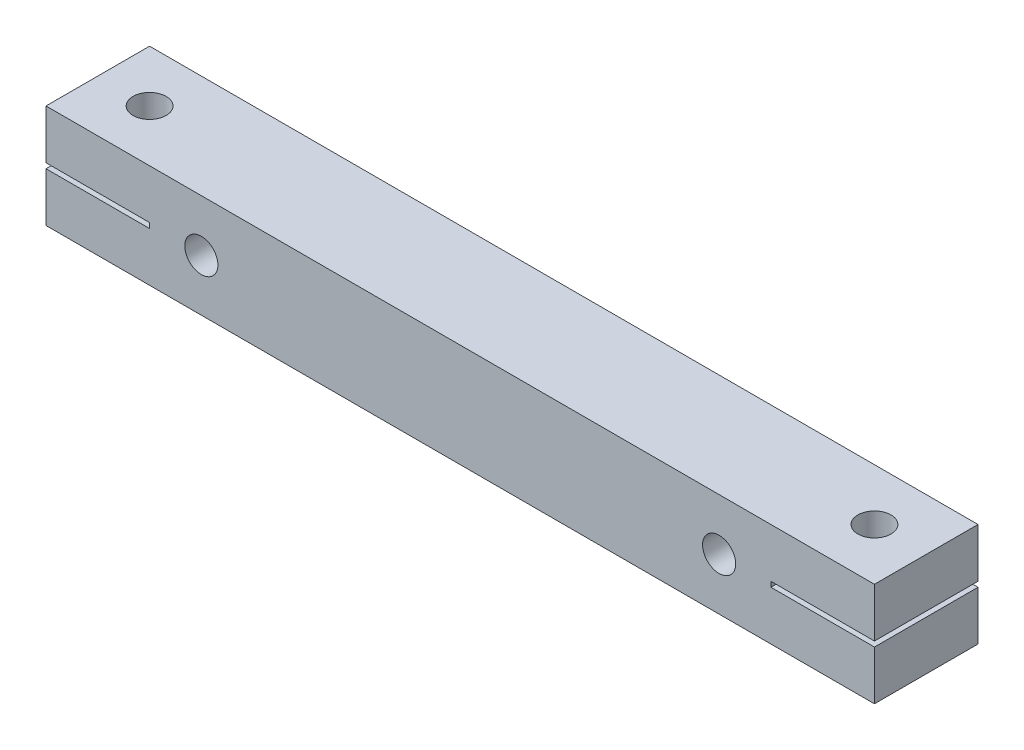
ISO-10303-21;
HEADER;
FILE_DESCRIPTION(('STEP AP214'),'2;1');
FILE_NAME('part.step','',(''),(''),'','','');
FILE_SCHEMA(('AUTOMOTIVE_DESIGN { 1 0 10303 214 1 1 1 1 }'));
ENDSEC;
DATA;
#1=APPLICATION_CONTEXT('core data for automotive mechanical design processes');
#2=APPLICATION_PROTOCOL_DEFINITION('international standard','automotive_design',2000,#1);
#3=PRODUCT_CONTEXT('',#1,'mechanical');
#4=PRODUCT('Part','Part','',(#3));
#5=PRODUCT_RELATED_PRODUCT_CATEGORY('part','',(#4));
#6=PRODUCT_DEFINITION_FORMATION('','',#4);
#7=PRODUCT_DEFINITION_CONTEXT('part definition',#1,'design');
#8=PRODUCT_DEFINITION('design','',#6,#7);
#9=PRODUCT_DEFINITION_SHAPE('','',#8);
#10=(LENGTH_UNIT() NAMED_UNIT(*) SI_UNIT(.MILLI.,.METRE.));
#11=(NAMED_UNIT(*) PLANE_ANGLE_UNIT() SI_UNIT($,.RADIAN.));
#12=(NAMED_UNIT(*) SI_UNIT($,.STERADIAN.) SOLID_ANGLE_UNIT());
#13=UNCERTAINTY_MEASURE_WITH_UNIT(LENGTH_MEASURE(1.E-05),#10,'distance_accuracy_value','');
#14=(GEOMETRIC_REPRESENTATION_CONTEXT(3) GLOBAL_UNCERTAINTY_ASSIGNED_CONTEXT((#13)) GLOBAL_UNIT_ASSIGNED_CONTEXT((#10,
#11,#12)) REPRESENTATION_CONTEXT('',''));
#15=CARTESIAN_POINT('',(0.,0.,0.));
#16=DIRECTION('',(0.,0.,1.));
#17=DIRECTION('',(1.,0.,0.));
#18=AXIS2_PLACEMENT_3D('',#15,#16,#17);
#19=CARTESIAN_POINT('',(0.,5.,5.));
#20=DIRECTION('',(1.,0.,0.));
#21=DIRECTION('',(0.,0.,-1.));
#22=AXIS2_PLACEMENT_3D('',#19,#20,#21);
#23=PLANE('',#22);
#24=DIRECTION('',(0.,0.,1.));
#25=VECTOR('',#24,1.);
#26=CARTESIAN_POINT('',(0.,0.25,-5.));
#27=LINE('',#26,#25);
#28=CARTESIAN_POINT('',(0.,0.25,-5.));
#29=VERTEX_POINT('',#28);
#30=CARTESIAN_POINT('',(0.,0.25,5.));
#31=VERTEX_POINT('',#30);
#32=EDGE_CURVE('E64',#29,#31,#27,.T.);
#33=ORIENTED_EDGE('',*,*,#32,.T.);
#34=DIRECTION('',(0.,-1.,0.));
#35=VECTOR('',#34,1.);
#36=CARTESIAN_POINT('',(0.,5.,5.));
#37=LINE('',#36,#35);
#38=CARTESIAN_POINT('',(0.,5.,5.));
#39=VERTEX_POINT('',#38);
#40=EDGE_CURVE('E192',#39,#31,#37,.T.);
#41=ORIENTED_EDGE('',*,*,#40,.F.);
#42=DIRECTION('',(0.,0.,-1.));
#43=VECTOR('',#42,1.);
#44=CARTESIAN_POINT('',(0.,5.,5.));
#45=LINE('',#44,#43);
#46=CARTESIAN_POINT('',(0.,5.,-5.));
#47=VERTEX_POINT('',#46);
#48=EDGE_CURVE('E204',#39,#47,#45,.T.);
#49=ORIENTED_EDGE('',*,*,#48,.T.);
#50=DIRECTION('',(0.,-1.,0.));
#51=VECTOR('',#50,1.);
#52=CARTESIAN_POINT('',(0.,5.,-5.));
#53=LINE('',#52,#51);
#54=EDGE_CURVE('E205',#47,#29,#53,.T.);
#55=ORIENTED_EDGE('',*,*,#54,.T.);
#56=EDGE_LOOP('',(#33,#41,#49,#55));
#57=FACE_BOUND('',#56,.T.);
#58=ADVANCED_FACE('F39',(#57),#23,.F.);
#59=CARTESIAN_POINT('',(80.,-5.,5.));
#60=DIRECTION('',(-1.,0.,0.));
#61=DIRECTION('',(0.,0.,1.));
#62=AXIS2_PLACEMENT_3D('',#59,#60,#61);
#63=PLANE('',#62);
#64=DIRECTION('',(0.,0.,1.));
#65=VECTOR('',#64,1.);
#66=CARTESIAN_POINT('',(80.,-0.250000000000005,-5.));
#67=LINE('',#66,#65);
#68=CARTESIAN_POINT('',(80.,-0.250000000000005,-5.));
#69=VERTEX_POINT('',#68);
#70=CARTESIAN_POINT('',(80.,-0.250000000000005,5.));
#71=VERTEX_POINT('',#70);
#72=EDGE_CURVE('E187',#69,#71,#67,.T.);
#73=ORIENTED_EDGE('',*,*,#72,.T.);
#74=DIRECTION('',(0.,1.,0.));
#75=VECTOR('',#74,1.);
#76=CARTESIAN_POINT('',(80.,-5.,5.));
#77=LINE('',#76,#75);
#78=CARTESIAN_POINT('',(80.,-5.,5.));
#79=VERTEX_POINT('',#78);
#80=EDGE_CURVE('E199',#79,#71,#77,.T.);
#81=ORIENTED_EDGE('',*,*,#80,.F.);
#82=DIRECTION('',(0.,0.,-1.));
#83=VECTOR('',#82,1.);
#84=CARTESIAN_POINT('',(80.,-5.,5.));
#85=LINE('',#84,#83);
#86=CARTESIAN_POINT('',(80.,-5.,-5.));
#87=VERTEX_POINT('',#86);
#88=EDGE_CURVE('E48',#79,#87,#85,.T.);
#89=ORIENTED_EDGE('',*,*,#88,.T.);
#90=DIRECTION('',(0.,1.,0.));
#91=VECTOR('',#90,1.);
#92=CARTESIAN_POINT('',(80.,-5.,-5.));
#93=LINE('',#92,#91);
#94=EDGE_CURVE('E210',#87,#69,#93,.T.);
#95=ORIENTED_EDGE('',*,*,#94,.T.);
#96=EDGE_LOOP('',(#73,#81,#89,#95));
#97=FACE_BOUND('',#96,.T.);
#98=ADVANCED_FACE('F279',(#97),#63,.F.);
#99=CARTESIAN_POINT('',(0.,-0.25,5.));
#100=VERTEX_POINT('',#99);
#101=CARTESIAN_POINT('',(0.,-5.,5.));
#102=VERTEX_POINT('',#101);
#103=EDGE_CURVE('E196',#100,#102,#37,.T.);
#104=ORIENTED_EDGE('',*,*,#103,.F.);
#105=DIRECTION('',(0.,0.,1.));
#106=VECTOR('',#105,1.);
#107=CARTESIAN_POINT('',(0.,-0.25,-5.));
#108=LINE('',#107,#106);
#109=CARTESIAN_POINT('',(0.,-0.25,-5.));
#110=VERTEX_POINT('',#109);
#111=EDGE_CURVE('E166',#110,#100,#108,.T.);
#112=ORIENTED_EDGE('',*,*,#111,.F.);
#113=CARTESIAN_POINT('',(0.,-5.,-5.));
#114=VERTEX_POINT('',#113);
#115=EDGE_CURVE('E165',#110,#114,#53,.T.);
#116=ORIENTED_EDGE('',*,*,#115,.T.);
#117=DIRECTION('',(0.,0.,-1.));
#118=VECTOR('',#117,1.);
#119=CARTESIAN_POINT('',(0.,-5.,5.));
#120=LINE('',#119,#118);
#121=EDGE_CURVE('E11',#102,#114,#120,.T.);
#122=ORIENTED_EDGE('',*,*,#121,.F.);
#123=EDGE_LOOP('',(#104,#112,#116,#122));
#124=FACE_BOUND('',#123,.T.);
#125=ADVANCED_FACE('F41',(#124),#23,.F.);
#126=CARTESIAN_POINT('',(0.,-5.,5.));
#127=DIRECTION('',(0.,1.,0.));
#128=DIRECTION('',(0.,0.,1.));
#129=AXIS2_PLACEMENT_3D('',#126,#127,#128);
#130=PLANE('',#129);
#131=CARTESIAN_POINT('',(5.,-5.00000000000001,0.));
#132=DIRECTION('',(0.,1.,0.));
#133=DIRECTION('',(-1.,0.,0.));
#134=AXIS2_PLACEMENT_3D('',#131,#132,#133);
#135=CIRCLE('',#134,1.6);
#136=CARTESIAN_POINT('',(3.4,-5.00000000000001,0.));
#137=VERTEX_POINT('',#136);
#138=EDGE_CURVE('E224',#137,#137,#135,.T.);
#139=ORIENTED_EDGE('',*,*,#138,.T.);
#140=EDGE_LOOP('',(#139));
#141=FACE_BOUND('',#140,.T.);
#142=CARTESIAN_POINT('',(75.,-5.,0.));
#143=DIRECTION('',(0.,1.,0.));
#144=DIRECTION('',(-1.,0.,0.));
#145=AXIS2_PLACEMENT_3D('',#142,#143,#144);
#146=CIRCLE('',#145,1.60000000000001);
#147=CARTESIAN_POINT('',(73.4,-5.,0.));
#148=VERTEX_POINT('',#147);
#149=EDGE_CURVE('E242',#148,#148,#146,.T.);
#150=ORIENTED_EDGE('',*,*,#149,.T.);
#151=EDGE_LOOP('',(#150));
#152=FACE_BOUND('',#151,.T.);
#153=DIRECTION('',(1.,0.,0.));
#154=VECTOR('',#153,1.);
#155=CARTESIAN_POINT('',(0.,-5.,-5.));
#156=LINE('',#155,#154);
#157=EDGE_CURVE('E207',#114,#87,#156,.T.);
#158=ORIENTED_EDGE('',*,*,#157,.T.);
#159=ORIENTED_EDGE('',*,*,#88,.F.);
#160=DIRECTION('',(1.,0.,0.));
#161=VECTOR('',#160,1.);
#162=CARTESIAN_POINT('',(0.,-5.,5.));
#163=LINE('',#162,#161);
#164=EDGE_CURVE('E195',#102,#79,#163,.T.);
#165=ORIENTED_EDGE('',*,*,#164,.F.);
#166=ORIENTED_EDGE('',*,*,#121,.T.);
#167=EDGE_LOOP('',(#158,#159,#165,#166));
#168=FACE_BOUND('',#167,.T.);
#169=ADVANCED_FACE('F288',(#141,#152,#168),#130,.F.);
#170=CARTESIAN_POINT('',(80.,0.250000000000006,5.));
#171=VERTEX_POINT('',#170);
#172=CARTESIAN_POINT('',(80.,5.,5.));
#173=VERTEX_POINT('',#172);
#174=EDGE_CURVE('E198',#171,#173,#77,.T.);
#175=ORIENTED_EDGE('',*,*,#174,.F.);
#176=DIRECTION('',(0.,0.,1.));
#177=VECTOR('',#176,1.);
#178=CARTESIAN_POINT('',(80.,0.250000000000006,-5.));
#179=LINE('',#178,#177);
#180=CARTESIAN_POINT('',(80.,0.250000000000006,-5.));
#181=VERTEX_POINT('',#180);
#182=EDGE_CURVE('E161',#181,#171,#179,.T.);
#183=ORIENTED_EDGE('',*,*,#182,.F.);
#184=CARTESIAN_POINT('',(80.,5.,-5.));
#185=VERTEX_POINT('',#184);
#186=EDGE_CURVE('E209',#181,#185,#93,.T.);
#187=ORIENTED_EDGE('',*,*,#186,.T.);
#188=DIRECTION('',(0.,0.,-1.));
#189=VECTOR('',#188,1.);
#190=CARTESIAN_POINT('',(80.,5.,5.));
#191=LINE('',#190,#189);
#192=EDGE_CURVE('E217',#173,#185,#191,.T.);
#193=ORIENTED_EDGE('',*,*,#192,.F.);
#194=EDGE_LOOP('',(#175,#183,#187,#193));
#195=FACE_BOUND('',#194,.T.);
#196=ADVANCED_FACE('F286',(#195),#63,.F.);
#197=CARTESIAN_POINT('',(80.,5.,5.));
#198=DIRECTION('',(0.,-1.,0.));
#199=DIRECTION('',(0.,0.,-1.));
#200=AXIS2_PLACEMENT_3D('',#197,#198,#199);
#201=PLANE('',#200);
#202=CARTESIAN_POINT('',(5.,5.,0.));
#203=DIRECTION('',(0.,1.,0.));
#204=DIRECTION('',(-1.,0.,0.));
#205=AXIS2_PLACEMENT_3D('',#202,#203,#204);
#206=CIRCLE('',#205,1.6);
#207=CARTESIAN_POINT('',(3.4,5.,0.));
#208=VERTEX_POINT('',#207);
#209=EDGE_CURVE('E229',#208,#208,#206,.T.);
#210=ORIENTED_EDGE('',*,*,#209,.F.);
#211=EDGE_LOOP('',(#210));
#212=FACE_BOUND('',#211,.T.);
#213=CARTESIAN_POINT('',(75.,5.00000000000001,0.));
#214=DIRECTION('',(0.,1.,0.));
#215=DIRECTION('',(-1.,0.,0.));
#216=AXIS2_PLACEMENT_3D('',#213,#214,#215);
#217=CIRCLE('',#216,1.60000000000001);
#218=CARTESIAN_POINT('',(73.4,5.00000000000001,0.));
#219=VERTEX_POINT('',#218);
#220=EDGE_CURVE('E234',#219,#219,#217,.T.);
#221=ORIENTED_EDGE('',*,*,#220,.F.);
#222=EDGE_LOOP('',(#221));
#223=FACE_BOUND('',#222,.T.);
#224=DIRECTION('',(-1.,0.,0.));
#225=VECTOR('',#224,1.);
#226=CARTESIAN_POINT('',(80.,5.,-5.));
#227=LINE('',#226,#225);
#228=EDGE_CURVE('E213',#185,#47,#227,.T.);
#229=ORIENTED_EDGE('',*,*,#228,.T.);
#230=ORIENTED_EDGE('',*,*,#48,.F.);
#231=DIRECTION('',(-1.,0.,0.));
#232=VECTOR('',#231,1.);
#233=CARTESIAN_POINT('',(80.,5.,5.));
#234=LINE('',#233,#232);
#235=EDGE_CURVE('E202',#173,#39,#234,.T.);
#236=ORIENTED_EDGE('',*,*,#235,.F.);
#237=ORIENTED_EDGE('',*,*,#192,.T.);
#238=EDGE_LOOP('',(#229,#230,#236,#237));
#239=FACE_BOUND('',#238,.T.);
#240=ADVANCED_FACE('F323',(#212,#223,#239),#201,.F.);
#241=CARTESIAN_POINT('',(0.,0.,5.));
#242=DIRECTION('',(0.,0.,1.));
#243=DIRECTION('',(1.,0.,0.));
#244=AXIS2_PLACEMENT_3D('',#241,#242,#243);
#245=PLANE('',#244);
#246=CARTESIAN_POINT('',(15.,0.,5.));
#247=DIRECTION('',(0.,0.,1.));
#248=DIRECTION('',(1.,0.,0.));
#249=AXIS2_PLACEMENT_3D('',#246,#247,#248);
#250=CIRCLE('',#249,1.6);
#251=CARTESIAN_POINT('',(16.6,0.,5.));
#252=VERTEX_POINT('',#251);
#253=EDGE_CURVE('E248',#252,#252,#250,.T.);
#254=ORIENTED_EDGE('',*,*,#253,.F.);
#255=EDGE_LOOP('',(#254));
#256=FACE_BOUND('',#255,.T.);
#257=CARTESIAN_POINT('',(65.,0.,5.));
#258=DIRECTION('',(0.,0.,1.));
#259=DIRECTION('',(1.,0.,0.));
#260=AXIS2_PLACEMENT_3D('',#257,#258,#259);
#261=CIRCLE('',#260,1.60000000000001);
#262=CARTESIAN_POINT('',(66.6,0.,5.));
#263=VERTEX_POINT('',#262);
#264=EDGE_CURVE('E253',#263,#263,#261,.T.);
#265=ORIENTED_EDGE('',*,*,#264,.F.);
#266=EDGE_LOOP('',(#265));
#267=FACE_BOUND('',#266,.T.);
#268=DIRECTION('',(1.,0.,0.));
#269=VECTOR('',#268,1.);
#270=CARTESIAN_POINT('',(0.,-0.25,5.));
#271=LINE('',#270,#269);
#272=CARTESIAN_POINT('',(10.,-0.25,5.));
#273=VERTEX_POINT('',#272);
#274=EDGE_CURVE('E150',#100,#273,#271,.T.);
#275=ORIENTED_EDGE('',*,*,#274,.F.);
#276=ORIENTED_EDGE('',*,*,#103,.T.);
#277=ORIENTED_EDGE('',*,*,#164,.T.);
#278=ORIENTED_EDGE('',*,*,#80,.T.);
#279=DIRECTION('',(-1.,0.,0.));
#280=VECTOR('',#279,1.);
#281=CARTESIAN_POINT('',(0.,-0.250000000000015,5.));
#282=LINE('',#281,#280);
#283=CARTESIAN_POINT('',(70.,-0.250000000000006,5.));
#284=VERTEX_POINT('',#283);
#285=EDGE_CURVE('E173',#71,#284,#282,.T.);
#286=ORIENTED_EDGE('',*,*,#285,.T.);
#287=DIRECTION('',(0.,-1.,0.));
#288=VECTOR('',#287,1.);
#289=CARTESIAN_POINT('',(70.,0.,5.));
#290=LINE('',#289,#288);
#291=CARTESIAN_POINT('',(70.,0.250000000000006,5.));
#292=VERTEX_POINT('',#291);
#293=EDGE_CURVE('E182',#292,#284,#290,.T.);
#294=ORIENTED_EDGE('',*,*,#293,.F.);
#295=DIRECTION('',(-1.,0.,0.));
#296=VECTOR('',#295,1.);
#297=CARTESIAN_POINT('',(0.,0.250000000000015,5.));
#298=LINE('',#297,#296);
#299=EDGE_CURVE('E179',#171,#292,#298,.T.);
#300=ORIENTED_EDGE('',*,*,#299,.F.);
#301=ORIENTED_EDGE('',*,*,#174,.T.);
#302=ORIENTED_EDGE('',*,*,#235,.T.);
#303=ORIENTED_EDGE('',*,*,#40,.T.);
#304=DIRECTION('',(1.,0.,0.));
#305=VECTOR('',#304,1.);
#306=CARTESIAN_POINT('',(0.,0.25,5.));
#307=LINE('',#306,#305);
#308=CARTESIAN_POINT('',(10.,0.25,5.));
#309=VERTEX_POINT('',#308);
#310=EDGE_CURVE('E153',#31,#309,#307,.T.);
#311=ORIENTED_EDGE('',*,*,#310,.T.);
#312=DIRECTION('',(0.,-1.,0.));
#313=VECTOR('',#312,1.);
#314=CARTESIAN_POINT('',(10.,0.,5.));
#315=LINE('',#314,#313);
#316=EDGE_CURVE('E144',#309,#273,#315,.T.);
#317=ORIENTED_EDGE('',*,*,#316,.T.);
#318=EDGE_LOOP('',(#275,#276,#277,#278,#286,#294,#300,#301,#302,#303,#311,#317));
#319=FACE_BOUND('',#318,.T.);
#320=ADVANCED_FACE('F300',(#256,#267,#319),#245,.T.);
#321=CARTESIAN_POINT('',(0.,0.,-5.));
#322=DIRECTION('',(0.,0.,1.));
#323=DIRECTION('',(1.,0.,0.));
#324=AXIS2_PLACEMENT_3D('',#321,#322,#323);
#325=PLANE('',#324);
#326=CARTESIAN_POINT('',(15.,0.,-5.));
#327=DIRECTION('',(0.,0.,1.));
#328=DIRECTION('',(1.,0.,0.));
#329=AXIS2_PLACEMENT_3D('',#326,#327,#328);
#330=CIRCLE('',#329,1.6);
#331=CARTESIAN_POINT('',(16.6,0.,-5.));
#332=VERTEX_POINT('',#331);
#333=EDGE_CURVE('E244',#332,#332,#330,.T.);
#334=ORIENTED_EDGE('',*,*,#333,.T.);
#335=EDGE_LOOP('',(#334));
#336=FACE_BOUND('',#335,.T.);
#337=CARTESIAN_POINT('',(65.,0.,-5.));
#338=DIRECTION('',(0.,0.,1.));
#339=DIRECTION('',(1.,0.,0.));
#340=AXIS2_PLACEMENT_3D('',#337,#338,#339);
#341=CIRCLE('',#340,1.60000000000001);
#342=CARTESIAN_POINT('',(66.6,0.,-5.));
#343=VERTEX_POINT('',#342);
#344=EDGE_CURVE('E237',#343,#343,#341,.T.);
#345=ORIENTED_EDGE('',*,*,#344,.T.);
#346=EDGE_LOOP('',(#345));
#347=FACE_BOUND('',#346,.T.);
#348=ORIENTED_EDGE('',*,*,#115,.F.);
#349=DIRECTION('',(1.,0.,0.));
#350=VECTOR('',#349,1.);
#351=CARTESIAN_POINT('',(0.,-0.25,-5.));
#352=LINE('',#351,#350);
#353=CARTESIAN_POINT('',(10.,-0.25,-5.));
#354=VERTEX_POINT('',#353);
#355=EDGE_CURVE('E137',#110,#354,#352,.T.);
#356=ORIENTED_EDGE('',*,*,#355,.T.);
#357=DIRECTION('',(0.,-1.,0.));
#358=VECTOR('',#357,1.);
#359=CARTESIAN_POINT('',(10.,0.,-5.));
#360=LINE('',#359,#358);
#361=CARTESIAN_POINT('',(10.,0.25,-5.));
#362=VERTEX_POINT('',#361);
#363=EDGE_CURVE('E138',#362,#354,#360,.T.);
#364=ORIENTED_EDGE('',*,*,#363,.F.);
#365=DIRECTION('',(1.,0.,0.));
#366=VECTOR('',#365,1.);
#367=CARTESIAN_POINT('',(0.,0.25,-5.));
#368=LINE('',#367,#366);
#369=EDGE_CURVE('E128',#29,#362,#368,.T.);
#370=ORIENTED_EDGE('',*,*,#369,.F.);
#371=ORIENTED_EDGE('',*,*,#54,.F.);
#372=ORIENTED_EDGE('',*,*,#228,.F.);
#373=ORIENTED_EDGE('',*,*,#186,.F.);
#374=DIRECTION('',(-1.,0.,0.));
#375=VECTOR('',#374,1.);
#376=CARTESIAN_POINT('',(0.,0.250000000000015,-5.));
#377=LINE('',#376,#375);
#378=CARTESIAN_POINT('',(70.,0.250000000000006,-5.));
#379=VERTEX_POINT('',#378);
#380=EDGE_CURVE('E169',#181,#379,#377,.T.);
#381=ORIENTED_EDGE('',*,*,#380,.T.);
#382=DIRECTION('',(0.,-1.,0.));
#383=VECTOR('',#382,1.);
#384=CARTESIAN_POINT('',(70.,0.,-5.));
#385=LINE('',#384,#383);
#386=CARTESIAN_POINT('',(70.,-0.250000000000006,-5.));
#387=VERTEX_POINT('',#386);
#388=EDGE_CURVE('E172',#379,#387,#385,.T.);
#389=ORIENTED_EDGE('',*,*,#388,.T.);
#390=DIRECTION('',(-1.,0.,0.));
#391=VECTOR('',#390,1.);
#392=CARTESIAN_POINT('',(0.,-0.250000000000015,-5.));
#393=LINE('',#392,#391);
#394=EDGE_CURVE('E176',#69,#387,#393,.T.);
#395=ORIENTED_EDGE('',*,*,#394,.F.);
#396=ORIENTED_EDGE('',*,*,#94,.F.);
#397=ORIENTED_EDGE('',*,*,#157,.F.);
#398=EDGE_LOOP('',(#348,#356,#364,#370,#371,#372,#373,#381,#389,#395,#396,#397));
#399=FACE_BOUND('',#398,.T.);
#400=ADVANCED_FACE('F149',(#336,#347,#399),#325,.F.);
#401=CARTESIAN_POINT('',(0.,0.250000000000015,-5.));
#402=DIRECTION('',(0.,1.,0.));
#403=DIRECTION('',(-1.,0.,0.));
#404=AXIS2_PLACEMENT_3D('',#401,#402,#403);
#405=PLANE('',#404);
#406=CARTESIAN_POINT('',(75.,0.250000000000005,0.));
#407=DIRECTION('',(0.,1.,0.));
#408=DIRECTION('',(-1.,0.,0.));
#409=AXIS2_PLACEMENT_3D('',#406,#407,#408);
#410=CIRCLE('',#409,1.60000000000001);
#411=CARTESIAN_POINT('',(73.4,0.250000000000006,0.));
#412=VERTEX_POINT('',#411);
#413=EDGE_CURVE('E156',#412,#412,#410,.T.);
#414=ORIENTED_EDGE('',*,*,#413,.T.);
#415=EDGE_LOOP('',(#414));
#416=FACE_BOUND('',#415,.T.);
#417=ORIENTED_EDGE('',*,*,#299,.T.);
#418=DIRECTION('',(0.,0.,1.));
#419=VECTOR('',#418,1.);
#420=CARTESIAN_POINT('',(70.,0.250000000000006,-5.));
#421=LINE('',#420,#419);
#422=EDGE_CURVE('E178',#379,#292,#421,.T.);
#423=ORIENTED_EDGE('',*,*,#422,.F.);
#424=ORIENTED_EDGE('',*,*,#380,.F.);
#425=ORIENTED_EDGE('',*,*,#182,.T.);
#426=EDGE_LOOP('',(#417,#423,#424,#425));
#427=FACE_BOUND('',#426,.T.);
#428=ADVANCED_FACE('F313',(#416,#427),#405,.F.);
#429=CARTESIAN_POINT('',(0.,-0.250000000000015,-5.));
#430=DIRECTION('',(0.,1.,0.));
#431=DIRECTION('',(-1.,0.,0.));
#432=AXIS2_PLACEMENT_3D('',#429,#430,#431);
#433=PLANE('',#432);
#434=CARTESIAN_POINT('',(75.,-0.250000000000005,0.));
#435=DIRECTION('',(0.,1.,0.));
#436=DIRECTION('',(-1.,0.,0.));
#437=AXIS2_PLACEMENT_3D('',#434,#435,#436);
#438=CIRCLE('',#437,1.60000000000001);
#439=CARTESIAN_POINT('',(73.4,-0.250000000000006,0.));
#440=VERTEX_POINT('',#439);
#441=EDGE_CURVE('E43',#440,#440,#438,.T.);
#442=ORIENTED_EDGE('',*,*,#441,.F.);
#443=EDGE_LOOP('',(#442));
#444=FACE_BOUND('',#443,.T.);
#445=ORIENTED_EDGE('',*,*,#285,.F.);
#446=ORIENTED_EDGE('',*,*,#72,.F.);
#447=ORIENTED_EDGE('',*,*,#394,.T.);
#448=DIRECTION('',(0.,0.,1.));
#449=VECTOR('',#448,1.);
#450=CARTESIAN_POINT('',(70.,-0.250000000000006,-5.));
#451=LINE('',#450,#449);
#452=EDGE_CURVE('E56',#387,#284,#451,.T.);
#453=ORIENTED_EDGE('',*,*,#452,.T.);
#454=EDGE_LOOP('',(#445,#446,#447,#453));
#455=FACE_BOUND('',#454,.T.);
#456=ADVANCED_FACE('F309',(#444,#455),#433,.T.);
#457=CARTESIAN_POINT('',(70.,0.,-5.));
#458=DIRECTION('',(-1.,0.,0.));
#459=DIRECTION('',(0.,0.,1.));
#460=AXIS2_PLACEMENT_3D('',#457,#458,#459);
#461=PLANE('',#460);
#462=ORIENTED_EDGE('',*,*,#293,.T.);
#463=ORIENTED_EDGE('',*,*,#452,.F.);
#464=ORIENTED_EDGE('',*,*,#388,.F.);
#465=ORIENTED_EDGE('',*,*,#422,.T.);
#466=EDGE_LOOP('',(#462,#463,#464,#465));
#467=FACE_BOUND('',#466,.T.);
#468=ADVANCED_FACE('F311',(#467),#461,.F.);
#469=CARTESIAN_POINT('',(10.,0.,-5.));
#470=DIRECTION('',(-1.,0.,0.));
#471=DIRECTION('',(0.,0.,1.));
#472=AXIS2_PLACEMENT_3D('',#469,#470,#471);
#473=PLANE('',#472);
#474=ORIENTED_EDGE('',*,*,#316,.F.);
#475=DIRECTION('',(0.,0.,1.));
#476=VECTOR('',#475,1.);
#477=CARTESIAN_POINT('',(10.,0.25,-5.));
#478=LINE('',#477,#476);
#479=EDGE_CURVE('E131',#362,#309,#478,.T.);
#480=ORIENTED_EDGE('',*,*,#479,.F.);
#481=ORIENTED_EDGE('',*,*,#363,.T.);
#482=DIRECTION('',(0.,0.,1.));
#483=VECTOR('',#482,1.);
#484=CARTESIAN_POINT('',(10.,-0.25,-5.));
#485=LINE('',#484,#483);
#486=EDGE_CURVE('E163',#354,#273,#485,.T.);
#487=ORIENTED_EDGE('',*,*,#486,.T.);
#488=EDGE_LOOP('',(#474,#480,#481,#487));
#489=FACE_BOUND('',#488,.T.);
#490=ADVANCED_FACE('F141',(#489),#473,.T.);
#491=CARTESIAN_POINT('',(0.,-0.25,-5.));
#492=DIRECTION('',(0.,-1.,0.));
#493=DIRECTION('',(1.,0.,0.));
#494=AXIS2_PLACEMENT_3D('',#491,#492,#493);
#495=PLANE('',#494);
#496=CARTESIAN_POINT('',(5.,-0.25,0.));
#497=DIRECTION('',(0.,-1.,0.));
#498=DIRECTION('',(1.,0.,0.));
#499=AXIS2_PLACEMENT_3D('',#496,#497,#498);
#500=CIRCLE('',#499,1.6);
#501=CARTESIAN_POINT('',(6.6,-0.25,0.));
#502=VERTEX_POINT('',#501);
#503=EDGE_CURVE('E223',#502,#502,#500,.T.);
#504=ORIENTED_EDGE('',*,*,#503,.T.);
#505=EDGE_LOOP('',(#504));
#506=FACE_BOUND('',#505,.T.);
#507=ORIENTED_EDGE('',*,*,#274,.T.);
#508=ORIENTED_EDGE('',*,*,#486,.F.);
#509=ORIENTED_EDGE('',*,*,#355,.F.);
#510=ORIENTED_EDGE('',*,*,#111,.T.);
#511=EDGE_LOOP('',(#507,#508,#509,#510));
#512=FACE_BOUND('',#511,.T.);
#513=ADVANCED_FACE('F347',(#506,#512),#495,.F.);
#514=CARTESIAN_POINT('',(0.,0.25,-5.));
#515=DIRECTION('',(0.,-1.,0.));
#516=DIRECTION('',(1.,0.,0.));
#517=AXIS2_PLACEMENT_3D('',#514,#515,#516);
#518=PLANE('',#517);
#519=CARTESIAN_POINT('',(5.,0.25,0.));
#520=DIRECTION('',(0.,-1.,0.));
#521=DIRECTION('',(1.,0.,0.));
#522=AXIS2_PLACEMENT_3D('',#519,#520,#521);
#523=CIRCLE('',#522,1.6);
#524=CARTESIAN_POINT('',(6.6,0.25,0.));
#525=VERTEX_POINT('',#524);
#526=EDGE_CURVE('E221',#525,#525,#523,.T.);
#527=ORIENTED_EDGE('',*,*,#526,.F.);
#528=EDGE_LOOP('',(#527));
#529=FACE_BOUND('',#528,.T.);
#530=ORIENTED_EDGE('',*,*,#310,.F.);
#531=ORIENTED_EDGE('',*,*,#32,.F.);
#532=ORIENTED_EDGE('',*,*,#369,.T.);
#533=ORIENTED_EDGE('',*,*,#479,.T.);
#534=EDGE_LOOP('',(#530,#531,#532,#533));
#535=FACE_BOUND('',#534,.T.);
#536=ADVANCED_FACE('F130',(#529,#535),#518,.T.);
#537=CARTESIAN_POINT('',(5.,-5.00000000000001,0.));
#538=DIRECTION('',(0.,1.,0.));
#539=DIRECTION('',(-1.,0.,0.));
#540=AXIS2_PLACEMENT_3D('',#537,#538,#539);
#541=CYLINDRICAL_SURFACE('',#540,1.6);
#542=ORIENTED_EDGE('',*,*,#526,.T.);
#543=EDGE_LOOP('',(#542));
#544=FACE_BOUND('',#543,.T.);
#545=ORIENTED_EDGE('',*,*,#209,.T.);
#546=EDGE_LOOP('',(#545));
#547=FACE_BOUND('',#546,.T.);
#548=ADVANCED_FACE('F350',(#544,#547),#541,.F.);
#549=ORIENTED_EDGE('',*,*,#138,.F.);
#550=EDGE_LOOP('',(#549));
#551=FACE_BOUND('',#550,.T.);
#552=ORIENTED_EDGE('',*,*,#503,.F.);
#553=EDGE_LOOP('',(#552));
#554=FACE_BOUND('',#553,.T.);
#555=ADVANCED_FACE('F355',(#551,#554),#541,.F.);
#556=CARTESIAN_POINT('',(75.,-5.,0.));
#557=DIRECTION('',(0.,1.,0.));
#558=DIRECTION('',(-1.,0.,0.));
#559=AXIS2_PLACEMENT_3D('',#556,#557,#558);
#560=CYLINDRICAL_SURFACE('',#559,1.60000000000001);
#561=ORIENTED_EDGE('',*,*,#441,.T.);
#562=EDGE_LOOP('',(#561));
#563=FACE_BOUND('',#562,.T.);
#564=ORIENTED_EDGE('',*,*,#149,.F.);
#565=EDGE_LOOP('',(#564));
#566=FACE_BOUND('',#565,.T.);
#567=ADVANCED_FACE('F274',(#563,#566),#560,.F.);
#568=ORIENTED_EDGE('',*,*,#220,.T.);
#569=EDGE_LOOP('',(#568));
#570=FACE_BOUND('',#569,.T.);
#571=ORIENTED_EDGE('',*,*,#413,.F.);
#572=EDGE_LOOP('',(#571));
#573=FACE_BOUND('',#572,.T.);
#574=ADVANCED_FACE('F265',(#570,#573),#560,.F.);
#575=CARTESIAN_POINT('',(65.,0.,-5.));
#576=DIRECTION('',(0.,0.,1.));
#577=DIRECTION('',(1.,0.,0.));
#578=AXIS2_PLACEMENT_3D('',#575,#576,#577);
#579=CYLINDRICAL_SURFACE('',#578,1.60000000000001);
#580=ORIENTED_EDGE('',*,*,#344,.F.);
#581=EDGE_LOOP('',(#580));
#582=FACE_BOUND('',#581,.T.);
#583=ORIENTED_EDGE('',*,*,#264,.T.);
#584=EDGE_LOOP('',(#583));
#585=FACE_BOUND('',#584,.T.);
#586=ADVANCED_FACE('F262',(#582,#585),#579,.F.);
#587=CARTESIAN_POINT('',(15.,0.,-5.));
#588=DIRECTION('',(0.,0.,1.));
#589=DIRECTION('',(1.,0.,0.));
#590=AXIS2_PLACEMENT_3D('',#587,#588,#589);
#591=CYLINDRICAL_SURFACE('',#590,1.6);
#592=ORIENTED_EDGE('',*,*,#333,.F.);
#593=EDGE_LOOP('',(#592));
#594=FACE_BOUND('',#593,.T.);
#595=ORIENTED_EDGE('',*,*,#253,.T.);
#596=EDGE_LOOP('',(#595));
#597=FACE_BOUND('',#596,.T.);
#598=ADVANCED_FACE('F264',(#594,#597),#591,.F.);
#599=CLOSED_SHELL('',(#58,#98,#125,#169,#196,#240,#320,#400,#428,#456,#468,#490,#513,#536,#548,
#555,#567,#574,#586,#598));
#600=MANIFOLD_SOLID_BREP('B2',#599);
#601=ADVANCED_BREP_SHAPE_REPRESENTATION('',(#18,#600),#14);
#602=SHAPE_DEFINITION_REPRESENTATION(#9,#601);
ENDSEC;
END-ISO-10303-21;
